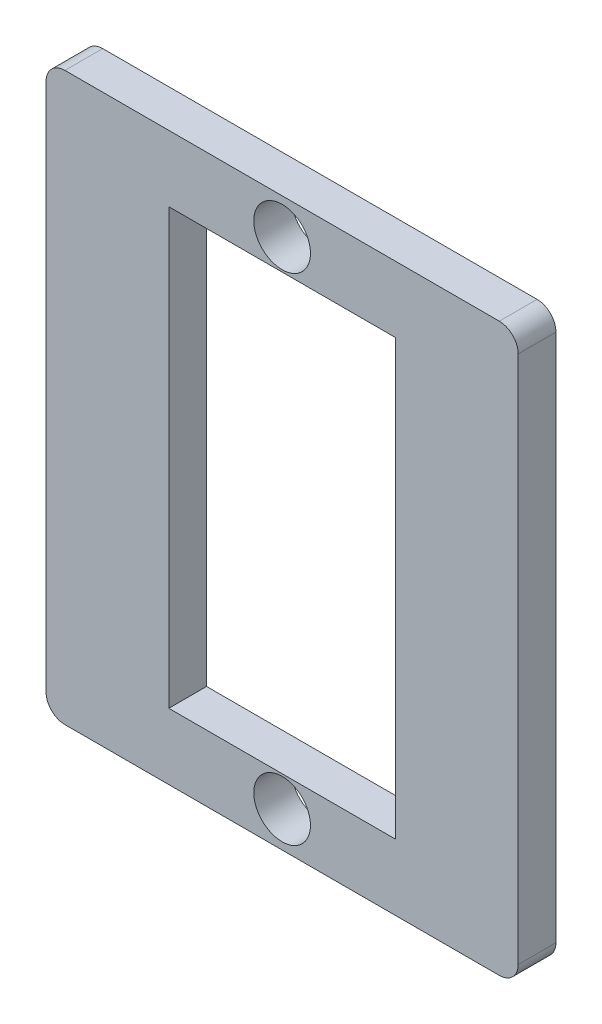
ISO-10303-21;
HEADER;
FILE_DESCRIPTION(('STEP AP214'),'2;1');
FILE_NAME('part.step','',(''),(''),'','','');
FILE_SCHEMA(('AUTOMOTIVE_DESIGN { 1 0 10303 214 1 1 1 1 }'));
ENDSEC;
DATA;
#1=APPLICATION_CONTEXT('core data for automotive mechanical design processes');
#2=APPLICATION_PROTOCOL_DEFINITION('international standard','automotive_design',2000,#1);
#3=PRODUCT_CONTEXT('',#1,'mechanical');
#4=PRODUCT('Part','Part','',(#3));
#5=PRODUCT_RELATED_PRODUCT_CATEGORY('part','',(#4));
#6=PRODUCT_DEFINITION_FORMATION('','',#4);
#7=PRODUCT_DEFINITION_CONTEXT('part definition',#1,'design');
#8=PRODUCT_DEFINITION('design','',#6,#7);
#9=PRODUCT_DEFINITION_SHAPE('','',#8);
#10=(LENGTH_UNIT() NAMED_UNIT(*) SI_UNIT(.MILLI.,.METRE.));
#11=(NAMED_UNIT(*) PLANE_ANGLE_UNIT() SI_UNIT($,.RADIAN.));
#12=(NAMED_UNIT(*) SI_UNIT($,.STERADIAN.) SOLID_ANGLE_UNIT());
#13=UNCERTAINTY_MEASURE_WITH_UNIT(LENGTH_MEASURE(1.E-05),#10,'distance_accuracy_value','');
#14=(GEOMETRIC_REPRESENTATION_CONTEXT(3) GLOBAL_UNCERTAINTY_ASSIGNED_CONTEXT((#13)) GLOBAL_UNIT_ASSIGNED_CONTEXT((#10,
#11,#12)) REPRESENTATION_CONTEXT('',''));
#15=CARTESIAN_POINT('',(0.,0.,0.));
#16=DIRECTION('',(0.,0.,1.));
#17=DIRECTION('',(1.,0.,0.));
#18=AXIS2_PLACEMENT_3D('',#15,#16,#17);
#19=CARTESIAN_POINT('',(0.,-0.0003985014628637,2.));
#20=DIRECTION('',(0.,0.,1.));
#21=DIRECTION('',(1.,0.,0.));
#22=AXIS2_PLACEMENT_3D('',#19,#20,#21);
#23=PLANE('',#22);
#24=CARTESIAN_POINT('',(0.,-13.12,2.));
#25=DIRECTION('',(0.,0.,1.));
#26=DIRECTION('',(1.,0.,0.));
#27=AXIS2_PLACEMENT_3D('',#24,#25,#26);
#28=CIRCLE('',#27,1.5);
#29=CARTESIAN_POINT('',(1.5,-13.12,2.));
#30=VERTEX_POINT('',#29);
#31=EDGE_CURVE('E9',#30,#30,#28,.T.);
#32=ORIENTED_EDGE('',*,*,#31,.F.);
#33=EDGE_LOOP('',(#32));
#34=FACE_BOUND('',#33,.T.);
#35=CARTESIAN_POINT('',(0.,13.11,2.));
#36=DIRECTION('',(0.,0.,1.));
#37=DIRECTION('',(1.,0.,0.));
#38=AXIS2_PLACEMENT_3D('',#35,#36,#37);
#39=CIRCLE('',#38,1.5);
#40=CARTESIAN_POINT('',(1.5,13.11,2.));
#41=VERTEX_POINT('',#40);
#42=EDGE_CURVE('E164',#41,#41,#39,.T.);
#43=ORIENTED_EDGE('',*,*,#42,.F.);
#44=EDGE_LOOP('',(#43));
#45=FACE_BOUND('',#44,.T.);
#46=DIRECTION('',(-1.,0.,0.));
#47=VECTOR('',#46,1.);
#48=CARTESIAN_POINT('',(6.,11.5,2.));
#49=LINE('',#48,#47);
#50=CARTESIAN_POINT('',(6.,11.5,2.));
#51=VERTEX_POINT('',#50);
#52=CARTESIAN_POINT('',(-6.,11.5,2.));
#53=VERTEX_POINT('',#52);
#54=EDGE_CURVE('E123',#51,#53,#49,.T.);
#55=ORIENTED_EDGE('',*,*,#54,.F.);
#56=DIRECTION('',(0.,1.,0.));
#57=VECTOR('',#56,1.);
#58=CARTESIAN_POINT('',(6.,-11.5,2.));
#59=LINE('',#58,#57);
#60=CARTESIAN_POINT('',(6.,-11.5,2.));
#61=VERTEX_POINT('',#60);
#62=EDGE_CURVE('E130',#61,#51,#59,.T.);
#63=ORIENTED_EDGE('',*,*,#62,.F.);
#64=DIRECTION('',(1.,0.,0.));
#65=VECTOR('',#64,1.);
#66=CARTESIAN_POINT('',(-6.,-11.5,2.));
#67=LINE('',#66,#65);
#68=CARTESIAN_POINT('',(-6.,-11.5,2.));
#69=VERTEX_POINT('',#68);
#70=EDGE_CURVE('E236',#69,#61,#67,.T.);
#71=ORIENTED_EDGE('',*,*,#70,.F.);
#72=DIRECTION('',(0.,-1.,0.));
#73=VECTOR('',#72,1.);
#74=CARTESIAN_POINT('',(-6.,11.5,2.));
#75=LINE('',#74,#73);
#76=EDGE_CURVE('E295',#53,#69,#75,.T.);
#77=ORIENTED_EDGE('',*,*,#76,.F.);
#78=EDGE_LOOP('',(#55,#63,#71,#77));
#79=FACE_BOUND('',#78,.T.);
#80=DIRECTION('',(-1.,0.,0.));
#81=VECTOR('',#80,1.);
#82=CARTESIAN_POINT('',(12.5,15.,2.));
#83=LINE('',#82,#81);
#84=CARTESIAN_POINT('',(11.5,15.,2.));
#85=VERTEX_POINT('',#84);
#86=CARTESIAN_POINT('',(-11.5,15.,2.));
#87=VERTEX_POINT('',#86);
#88=EDGE_CURVE('E179',#85,#87,#83,.T.);
#89=ORIENTED_EDGE('',*,*,#88,.T.);
#90=CARTESIAN_POINT('',(-11.5,14.,2.));
#91=DIRECTION('',(0.,0.,-1.));
#92=DIRECTION('',(0.,-1.,0.));
#93=AXIS2_PLACEMENT_3D('',#90,#91,#92);
#94=CIRCLE('',#93,1.);
#95=CARTESIAN_POINT('',(-12.5,14.,2.));
#96=VERTEX_POINT('',#95);
#97=EDGE_CURVE('E192',#96,#87,#94,.T.);
#98=ORIENTED_EDGE('',*,*,#97,.F.);
#99=DIRECTION('',(0.,-1.,0.));
#100=VECTOR('',#99,1.);
#101=CARTESIAN_POINT('',(-12.5,15.,2.));
#102=LINE('',#101,#100);
#103=CARTESIAN_POINT('',(-12.5,-14.,2.));
#104=VERTEX_POINT('',#103);
#105=EDGE_CURVE('E200',#96,#104,#102,.T.);
#106=ORIENTED_EDGE('',*,*,#105,.T.);
#107=CARTESIAN_POINT('',(-11.5,-14.,2.));
#108=DIRECTION('',(0.,0.,1.));
#109=DIRECTION('',(0.,-1.,0.));
#110=AXIS2_PLACEMENT_3D('',#107,#108,#109);
#111=CIRCLE('',#110,1.);
#112=CARTESIAN_POINT('',(-11.5,-15.,2.));
#113=VERTEX_POINT('',#112);
#114=EDGE_CURVE('E232',#104,#113,#111,.T.);
#115=ORIENTED_EDGE('',*,*,#114,.T.);
#116=DIRECTION('',(1.,0.,0.));
#117=VECTOR('',#116,1.);
#118=CARTESIAN_POINT('',(-12.5,-15.,2.));
#119=LINE('',#118,#117);
#120=CARTESIAN_POINT('',(11.5,-15.,2.));
#121=VERTEX_POINT('',#120);
#122=EDGE_CURVE('E228',#113,#121,#119,.T.);
#123=ORIENTED_EDGE('',*,*,#122,.T.);
#124=CARTESIAN_POINT('',(11.5,-14.,2.));
#125=DIRECTION('',(0.,0.,1.));
#126=DIRECTION('',(0.,-1.,0.));
#127=AXIS2_PLACEMENT_3D('',#124,#125,#126);
#128=CIRCLE('',#127,1.);
#129=CARTESIAN_POINT('',(12.5,-14.,2.));
#130=VERTEX_POINT('',#129);
#131=EDGE_CURVE('E197',#121,#130,#128,.T.);
#132=ORIENTED_EDGE('',*,*,#131,.T.);
#133=DIRECTION('',(0.,1.,0.));
#134=VECTOR('',#133,1.);
#135=CARTESIAN_POINT('',(12.5,-15.,2.));
#136=LINE('',#135,#134);
#137=CARTESIAN_POINT('',(12.5,14.,2.));
#138=VERTEX_POINT('',#137);
#139=EDGE_CURVE('E195',#130,#138,#136,.T.);
#140=ORIENTED_EDGE('',*,*,#139,.T.);
#141=CARTESIAN_POINT('',(11.5,14.,2.));
#142=DIRECTION('',(0.,0.,-1.));
#143=DIRECTION('',(0.,-1.,0.));
#144=AXIS2_PLACEMENT_3D('',#141,#142,#143);
#145=CIRCLE('',#144,1.);
#146=EDGE_CURVE('E303',#85,#138,#145,.T.);
#147=ORIENTED_EDGE('',*,*,#146,.F.);
#148=EDGE_LOOP('',(#89,#98,#106,#115,#123,#132,#140,#147));
#149=FACE_BOUND('',#148,.T.);
#150=ADVANCED_FACE('F14',(#34,#45,#79,#149),#23,.T.);
#151=CARTESIAN_POINT('',(0.,-13.12,0.));
#152=DIRECTION('',(0.,0.,-1.));
#153=DIRECTION('',(1.,0.,0.));
#154=AXIS2_PLACEMENT_3D('',#151,#152,#153);
#155=CYLINDRICAL_SURFACE('',#154,1.5);
#156=DIRECTION('',(0.,0.,1.));
#157=VECTOR('',#156,1.);
#158=CARTESIAN_POINT('',(1.5,-13.12,0.));
#159=LINE('',#158,#157);
#160=CARTESIAN_POINT('',(1.5,-13.12,0.));
#161=VERTEX_POINT('',#160);
#162=EDGE_CURVE('E25',#161,#30,#159,.T.);
#163=ORIENTED_EDGE('',*,*,#162,.T.);
#164=ORIENTED_EDGE('',*,*,#31,.T.);
#165=ORIENTED_EDGE('',*,*,#162,.F.);
#166=CARTESIAN_POINT('',(0.,-13.12,0.));
#167=DIRECTION('',(0.,0.,1.));
#168=DIRECTION('',(1.,0.,0.));
#169=AXIS2_PLACEMENT_3D('',#166,#167,#168);
#170=CIRCLE('',#169,1.5);
#171=EDGE_CURVE('E162',#161,#161,#170,.T.);
#172=ORIENTED_EDGE('',*,*,#171,.F.);
#173=EDGE_LOOP('',(#163,#164,#165,#172));
#174=FACE_BOUND('',#173,.T.);
#175=ADVANCED_FACE('F161',(#174),#155,.F.);
#176=CARTESIAN_POINT('',(0.,13.11,0.));
#177=DIRECTION('',(0.,0.,-1.));
#178=DIRECTION('',(1.,0.,0.));
#179=AXIS2_PLACEMENT_3D('',#176,#177,#178);
#180=CYLINDRICAL_SURFACE('',#179,1.5);
#181=DIRECTION('',(0.,0.,1.));
#182=VECTOR('',#181,1.);
#183=CARTESIAN_POINT('',(1.5,13.11,0.));
#184=LINE('',#183,#182);
#185=CARTESIAN_POINT('',(1.5,13.11,0.));
#186=VERTEX_POINT('',#185);
#187=EDGE_CURVE('E221',#186,#41,#184,.T.);
#188=ORIENTED_EDGE('',*,*,#187,.T.);
#189=ORIENTED_EDGE('',*,*,#42,.T.);
#190=ORIENTED_EDGE('',*,*,#187,.F.);
#191=CARTESIAN_POINT('',(0.,13.11,0.));
#192=DIRECTION('',(0.,0.,1.));
#193=DIRECTION('',(1.,0.,0.));
#194=AXIS2_PLACEMENT_3D('',#191,#192,#193);
#195=CIRCLE('',#194,1.5);
#196=EDGE_CURVE('E171',#186,#186,#195,.T.);
#197=ORIENTED_EDGE('',*,*,#196,.F.);
#198=EDGE_LOOP('',(#188,#189,#190,#197));
#199=FACE_BOUND('',#198,.T.);
#200=ADVANCED_FACE('F487',(#199),#180,.F.);
#201=CARTESIAN_POINT('',(6.,11.5,0.));
#202=DIRECTION('',(0.,-1.,0.));
#203=DIRECTION('',(0.,0.,-1.));
#204=AXIS2_PLACEMENT_3D('',#201,#202,#203);
#205=PLANE('',#204);
#206=DIRECTION('',(0.,0.,1.));
#207=VECTOR('',#206,1.);
#208=CARTESIAN_POINT('',(6.,11.5,0.));
#209=LINE('',#208,#207);
#210=CARTESIAN_POINT('',(6.,11.5,0.));
#211=VERTEX_POINT('',#210);
#212=EDGE_CURVE('E243',#211,#51,#209,.T.);
#213=ORIENTED_EDGE('',*,*,#212,.T.);
#214=ORIENTED_EDGE('',*,*,#54,.T.);
#215=DIRECTION('',(0.,0.,1.));
#216=VECTOR('',#215,1.);
#217=CARTESIAN_POINT('',(-6.,11.5,0.));
#218=LINE('',#217,#216);
#219=CARTESIAN_POINT('',(-6.,11.5,0.));
#220=VERTEX_POINT('',#219);
#221=EDGE_CURVE('E231',#220,#53,#218,.T.);
#222=ORIENTED_EDGE('',*,*,#221,.F.);
#223=DIRECTION('',(-1.,0.,0.));
#224=VECTOR('',#223,1.);
#225=CARTESIAN_POINT('',(6.,11.5,0.));
#226=LINE('',#225,#224);
#227=EDGE_CURVE('E182',#211,#220,#226,.T.);
#228=ORIENTED_EDGE('',*,*,#227,.F.);
#229=EDGE_LOOP('',(#213,#214,#222,#228));
#230=FACE_BOUND('',#229,.T.);
#231=ADVANCED_FACE('F483',(#230),#205,.T.);
#232=CARTESIAN_POINT('',(6.,-11.5,0.));
#233=DIRECTION('',(-1.,0.,0.));
#234=DIRECTION('',(0.,0.,1.));
#235=AXIS2_PLACEMENT_3D('',#232,#233,#234);
#236=PLANE('',#235);
#237=DIRECTION('',(0.,0.,1.));
#238=VECTOR('',#237,1.);
#239=CARTESIAN_POINT('',(6.,-11.5,0.));
#240=LINE('',#239,#238);
#241=CARTESIAN_POINT('',(6.,-11.5,0.));
#242=VERTEX_POINT('',#241);
#243=EDGE_CURVE('E233',#242,#61,#240,.T.);
#244=ORIENTED_EDGE('',*,*,#243,.T.);
#245=ORIENTED_EDGE('',*,*,#62,.T.);
#246=ORIENTED_EDGE('',*,*,#212,.F.);
#247=DIRECTION('',(0.,1.,0.));
#248=VECTOR('',#247,1.);
#249=CARTESIAN_POINT('',(6.,-11.5,0.));
#250=LINE('',#249,#248);
#251=EDGE_CURVE('E250',#242,#211,#250,.T.);
#252=ORIENTED_EDGE('',*,*,#251,.F.);
#253=EDGE_LOOP('',(#244,#245,#246,#252));
#254=FACE_BOUND('',#253,.T.);
#255=ADVANCED_FACE('F308',(#254),#236,.T.);
#256=CARTESIAN_POINT('',(-6.,-11.5,0.));
#257=DIRECTION('',(0.,1.,0.));
#258=DIRECTION('',(1.,0.,0.));
#259=AXIS2_PLACEMENT_3D('',#256,#257,#258);
#260=PLANE('',#259);
#261=DIRECTION('',(0.,0.,1.));
#262=VECTOR('',#261,1.);
#263=CARTESIAN_POINT('',(-6.,-11.5,0.));
#264=LINE('',#263,#262);
#265=CARTESIAN_POINT('',(-6.,-11.5,0.));
#266=VERTEX_POINT('',#265);
#267=EDGE_CURVE('E261',#266,#69,#264,.T.);
#268=ORIENTED_EDGE('',*,*,#267,.T.);
#269=ORIENTED_EDGE('',*,*,#70,.T.);
#270=ORIENTED_EDGE('',*,*,#243,.F.);
#271=DIRECTION('',(1.,0.,0.));
#272=VECTOR('',#271,1.);
#273=CARTESIAN_POINT('',(-6.,-11.5,0.));
#274=LINE('',#273,#272);
#275=EDGE_CURVE('E246',#266,#242,#274,.T.);
#276=ORIENTED_EDGE('',*,*,#275,.F.);
#277=EDGE_LOOP('',(#268,#269,#270,#276));
#278=FACE_BOUND('',#277,.T.);
#279=ADVANCED_FACE('F314',(#278),#260,.T.);
#280=CARTESIAN_POINT('',(-6.,11.5,0.));
#281=DIRECTION('',(1.,0.,0.));
#282=DIRECTION('',(0.,1.,0.));
#283=AXIS2_PLACEMENT_3D('',#280,#281,#282);
#284=PLANE('',#283);
#285=ORIENTED_EDGE('',*,*,#221,.T.);
#286=ORIENTED_EDGE('',*,*,#76,.T.);
#287=ORIENTED_EDGE('',*,*,#267,.F.);
#288=DIRECTION('',(0.,-1.,0.));
#289=VECTOR('',#288,1.);
#290=CARTESIAN_POINT('',(-6.,11.5,0.));
#291=LINE('',#290,#289);
#292=EDGE_CURVE('E190',#220,#266,#291,.T.);
#293=ORIENTED_EDGE('',*,*,#292,.F.);
#294=EDGE_LOOP('',(#285,#286,#287,#293));
#295=FACE_BOUND('',#294,.T.);
#296=ADVANCED_FACE('F321',(#295),#284,.T.);
#297=CARTESIAN_POINT('',(-12.5,-15.,0.));
#298=DIRECTION('',(0.,1.,0.));
#299=DIRECTION('',(1.,0.,0.));
#300=AXIS2_PLACEMENT_3D('',#297,#298,#299);
#301=PLANE('',#300);
#302=DIRECTION('',(0.,0.,1.));
#303=VECTOR('',#302,1.);
#304=CARTESIAN_POINT('',(11.5,-15.,0.));
#305=LINE('',#304,#303);
#306=CARTESIAN_POINT('',(11.5,-15.,0.));
#307=VERTEX_POINT('',#306);
#308=EDGE_CURVE('E199',#307,#121,#305,.T.);
#309=ORIENTED_EDGE('',*,*,#308,.T.);
#310=ORIENTED_EDGE('',*,*,#122,.F.);
#311=DIRECTION('',(0.,0.,1.));
#312=VECTOR('',#311,1.);
#313=CARTESIAN_POINT('',(-11.5,-15.,0.));
#314=LINE('',#313,#312);
#315=CARTESIAN_POINT('',(-11.5,-15.,0.));
#316=VERTEX_POINT('',#315);
#317=EDGE_CURVE('E257',#316,#113,#314,.T.);
#318=ORIENTED_EDGE('',*,*,#317,.F.);
#319=DIRECTION('',(1.,0.,0.));
#320=VECTOR('',#319,1.);
#321=CARTESIAN_POINT('',(-12.5,-15.,0.));
#322=LINE('',#321,#320);
#323=EDGE_CURVE('E267',#316,#307,#322,.T.);
#324=ORIENTED_EDGE('',*,*,#323,.T.);
#325=EDGE_LOOP('',(#309,#310,#318,#324));
#326=FACE_BOUND('',#325,.T.);
#327=ADVANCED_FACE('F354',(#326),#301,.F.);
#328=CARTESIAN_POINT('',(-11.5,-14.,0.));
#329=DIRECTION('',(0.,0.,1.));
#330=DIRECTION('',(-1.,0.,0.));
#331=AXIS2_PLACEMENT_3D('',#328,#329,#330);
#332=CYLINDRICAL_SURFACE('',#331,1.);
#333=CARTESIAN_POINT('',(-11.5,-14.,0.));
#334=DIRECTION('',(0.,0.,1.));
#335=DIRECTION('',(0.,-1.,0.));
#336=AXIS2_PLACEMENT_3D('',#333,#334,#335);
#337=CIRCLE('',#336,1.);
#338=CARTESIAN_POINT('',(-12.5,-14.,0.));
#339=VERTEX_POINT('',#338);
#340=EDGE_CURVE('E275',#339,#316,#337,.T.);
#341=ORIENTED_EDGE('',*,*,#340,.T.);
#342=ORIENTED_EDGE('',*,*,#317,.T.);
#343=ORIENTED_EDGE('',*,*,#114,.F.);
#344=DIRECTION('',(0.,0.,1.));
#345=VECTOR('',#344,1.);
#346=CARTESIAN_POINT('',(-12.5,-14.,0.));
#347=LINE('',#346,#345);
#348=EDGE_CURVE('E203',#339,#104,#347,.T.);
#349=ORIENTED_EDGE('',*,*,#348,.F.);
#350=EDGE_LOOP('',(#341,#342,#343,#349));
#351=FACE_BOUND('',#350,.T.);
#352=ADVANCED_FACE('F352',(#351),#332,.T.);
#353=CARTESIAN_POINT('',(11.5,-14.,0.));
#354=DIRECTION('',(0.,0.,1.));
#355=DIRECTION('',(0.,-1.,0.));
#356=AXIS2_PLACEMENT_3D('',#353,#354,#355);
#357=CYLINDRICAL_SURFACE('',#356,1.);
#358=CARTESIAN_POINT('',(11.5,-14.,0.));
#359=DIRECTION('',(0.,0.,1.));
#360=DIRECTION('',(0.,-1.,0.));
#361=AXIS2_PLACEMENT_3D('',#358,#359,#360);
#362=CIRCLE('',#361,1.);
#363=CARTESIAN_POINT('',(12.5,-14.,0.));
#364=VERTEX_POINT('',#363);
#365=EDGE_CURVE('E239',#307,#364,#362,.T.);
#366=ORIENTED_EDGE('',*,*,#365,.T.);
#367=DIRECTION('',(0.,0.,1.));
#368=VECTOR('',#367,1.);
#369=CARTESIAN_POINT('',(12.5,-14.,0.));
#370=LINE('',#369,#368);
#371=EDGE_CURVE('E87',#364,#130,#370,.T.);
#372=ORIENTED_EDGE('',*,*,#371,.T.);
#373=ORIENTED_EDGE('',*,*,#131,.F.);
#374=ORIENTED_EDGE('',*,*,#308,.F.);
#375=EDGE_LOOP('',(#366,#372,#373,#374));
#376=FACE_BOUND('',#375,.T.);
#377=ADVANCED_FACE('F355',(#376),#357,.T.);
#378=CARTESIAN_POINT('',(-12.5,15.,0.));
#379=DIRECTION('',(1.,0.,0.));
#380=DIRECTION('',(0.,1.,0.));
#381=AXIS2_PLACEMENT_3D('',#378,#379,#380);
#382=PLANE('',#381);
#383=ORIENTED_EDGE('',*,*,#348,.T.);
#384=ORIENTED_EDGE('',*,*,#105,.F.);
#385=DIRECTION('',(0.,0.,1.));
#386=VECTOR('',#385,1.);
#387=CARTESIAN_POINT('',(-12.5,14.,0.));
#388=LINE('',#387,#386);
#389=CARTESIAN_POINT('',(-12.5,14.,0.));
#390=VERTEX_POINT('',#389);
#391=EDGE_CURVE('E196',#390,#96,#388,.T.);
#392=ORIENTED_EDGE('',*,*,#391,.F.);
#393=DIRECTION('',(0.,-1.,0.));
#394=VECTOR('',#393,1.);
#395=CARTESIAN_POINT('',(-12.5,15.,0.));
#396=LINE('',#395,#394);
#397=EDGE_CURVE('E283',#390,#339,#396,.T.);
#398=ORIENTED_EDGE('',*,*,#397,.T.);
#399=EDGE_LOOP('',(#383,#384,#392,#398));
#400=FACE_BOUND('',#399,.T.);
#401=ADVANCED_FACE('F343',(#400),#382,.F.);
#402=CARTESIAN_POINT('',(12.5,-15.,0.));
#403=DIRECTION('',(-1.,0.,0.));
#404=DIRECTION('',(0.,0.,1.));
#405=AXIS2_PLACEMENT_3D('',#402,#403,#404);
#406=PLANE('',#405);
#407=DIRECTION('',(0.,0.,1.));
#408=VECTOR('',#407,1.);
#409=CARTESIAN_POINT('',(12.5,14.,0.));
#410=LINE('',#409,#408);
#411=CARTESIAN_POINT('',(12.5,14.,0.));
#412=VERTEX_POINT('',#411);
#413=EDGE_CURVE('E104',#412,#138,#410,.T.);
#414=ORIENTED_EDGE('',*,*,#413,.T.);
#415=ORIENTED_EDGE('',*,*,#139,.F.);
#416=ORIENTED_EDGE('',*,*,#371,.F.);
#417=DIRECTION('',(0.,1.,0.));
#418=VECTOR('',#417,1.);
#419=CARTESIAN_POINT('',(12.5,-15.,0.));
#420=LINE('',#419,#418);
#421=EDGE_CURVE('E227',#364,#412,#420,.T.);
#422=ORIENTED_EDGE('',*,*,#421,.T.);
#423=EDGE_LOOP('',(#414,#415,#416,#422));
#424=FACE_BOUND('',#423,.T.);
#425=ADVANCED_FACE('F356',(#424),#406,.F.);
#426=CARTESIAN_POINT('',(-11.5,14.,0.));
#427=DIRECTION('',(0.,0.,1.));
#428=DIRECTION('',(-1.,0.,0.));
#429=AXIS2_PLACEMENT_3D('',#426,#427,#428);
#430=CYLINDRICAL_SURFACE('',#429,1.);
#431=ORIENTED_EDGE('',*,*,#391,.T.);
#432=ORIENTED_EDGE('',*,*,#97,.T.);
#433=DIRECTION('',(0.,0.,1.));
#434=VECTOR('',#433,1.);
#435=CARTESIAN_POINT('',(-11.5,15.,0.));
#436=LINE('',#435,#434);
#437=CARTESIAN_POINT('',(-11.5,15.,0.));
#438=VERTEX_POINT('',#437);
#439=EDGE_CURVE('E170',#438,#87,#436,.T.);
#440=ORIENTED_EDGE('',*,*,#439,.F.);
#441=CARTESIAN_POINT('',(-11.5,14.,0.));
#442=DIRECTION('',(0.,0.,-1.));
#443=DIRECTION('',(0.,-1.,0.));
#444=AXIS2_PLACEMENT_3D('',#441,#442,#443);
#445=CIRCLE('',#444,1.);
#446=EDGE_CURVE('E191',#390,#438,#445,.T.);
#447=ORIENTED_EDGE('',*,*,#446,.F.);
#448=EDGE_LOOP('',(#431,#432,#440,#447));
#449=FACE_BOUND('',#448,.T.);
#450=ADVANCED_FACE('F16',(#449),#430,.T.);
#451=CARTESIAN_POINT('',(11.5,14.,0.));
#452=DIRECTION('',(0.,0.,1.));
#453=DIRECTION('',(0.,1.,0.));
#454=AXIS2_PLACEMENT_3D('',#451,#452,#453);
#455=CYLINDRICAL_SURFACE('',#454,1.);
#456=DIRECTION('',(0.,0.,1.));
#457=VECTOR('',#456,1.);
#458=CARTESIAN_POINT('',(11.5,15.,0.));
#459=LINE('',#458,#457);
#460=CARTESIAN_POINT('',(11.5,15.,0.));
#461=VERTEX_POINT('',#460);
#462=EDGE_CURVE('E18',#461,#85,#459,.T.);
#463=ORIENTED_EDGE('',*,*,#462,.T.);
#464=ORIENTED_EDGE('',*,*,#146,.T.);
#465=ORIENTED_EDGE('',*,*,#413,.F.);
#466=CARTESIAN_POINT('',(11.5,14.,0.));
#467=DIRECTION('',(0.,0.,-1.));
#468=DIRECTION('',(0.,-1.,0.));
#469=AXIS2_PLACEMENT_3D('',#466,#467,#468);
#470=CIRCLE('',#469,1.);
#471=EDGE_CURVE('E223',#461,#412,#470,.T.);
#472=ORIENTED_EDGE('',*,*,#471,.F.);
#473=EDGE_LOOP('',(#463,#464,#465,#472));
#474=FACE_BOUND('',#473,.T.);
#475=ADVANCED_FACE('F362',(#474),#455,.T.);
#476=CARTESIAN_POINT('',(12.5,15.,0.));
#477=DIRECTION('',(0.,-1.,0.));
#478=DIRECTION('',(0.,0.,-1.));
#479=AXIS2_PLACEMENT_3D('',#476,#477,#478);
#480=PLANE('',#479);
#481=ORIENTED_EDGE('',*,*,#439,.T.);
#482=ORIENTED_EDGE('',*,*,#88,.F.);
#483=ORIENTED_EDGE('',*,*,#462,.F.);
#484=DIRECTION('',(-1.,0.,0.));
#485=VECTOR('',#484,1.);
#486=CARTESIAN_POINT('',(12.5,15.,0.));
#487=LINE('',#486,#485);
#488=EDGE_CURVE('E186',#461,#438,#487,.T.);
#489=ORIENTED_EDGE('',*,*,#488,.T.);
#490=EDGE_LOOP('',(#481,#482,#483,#489));
#491=FACE_BOUND('',#490,.T.);
#492=ADVANCED_FACE('F348',(#491),#480,.F.);
#493=CARTESIAN_POINT('',(0.,-0.0003985014628637,0.));
#494=DIRECTION('',(0.,0.,1.));
#495=DIRECTION('',(1.,0.,0.));
#496=AXIS2_PLACEMENT_3D('',#493,#494,#495);
#497=PLANE('',#496);
#498=ORIENTED_EDGE('',*,*,#171,.T.);
#499=EDGE_LOOP('',(#498));
#500=FACE_BOUND('',#499,.T.);
#501=ORIENTED_EDGE('',*,*,#196,.T.);
#502=EDGE_LOOP('',(#501));
#503=FACE_BOUND('',#502,.T.);
#504=ORIENTED_EDGE('',*,*,#292,.T.);
#505=ORIENTED_EDGE('',*,*,#275,.T.);
#506=ORIENTED_EDGE('',*,*,#251,.T.);
#507=ORIENTED_EDGE('',*,*,#227,.T.);
#508=EDGE_LOOP('',(#504,#505,#506,#507));
#509=FACE_BOUND('',#508,.T.);
#510=ORIENTED_EDGE('',*,*,#471,.T.);
#511=ORIENTED_EDGE('',*,*,#421,.F.);
#512=ORIENTED_EDGE('',*,*,#365,.F.);
#513=ORIENTED_EDGE('',*,*,#323,.F.);
#514=ORIENTED_EDGE('',*,*,#340,.F.);
#515=ORIENTED_EDGE('',*,*,#397,.F.);
#516=ORIENTED_EDGE('',*,*,#446,.T.);
#517=ORIENTED_EDGE('',*,*,#488,.F.);
#518=EDGE_LOOP('',(#510,#511,#512,#513,#514,#515,#516,#517));
#519=FACE_BOUND('',#518,.T.);
#520=ADVANCED_FACE('F167',(#500,#503,#509,#519),#497,.F.);
#521=CLOSED_SHELL('',(#150,#175,#200,#231,#255,#279,#296,#327,#352,#377,#401,#425,#450,#475,
#492,#520));
#522=MANIFOLD_SOLID_BREP('B1',#521);
#523=ADVANCED_BREP_SHAPE_REPRESENTATION('',(#18,#522),#14);
#524=SHAPE_DEFINITION_REPRESENTATION(#9,#523);
ENDSEC;
END-ISO-10303-21;
